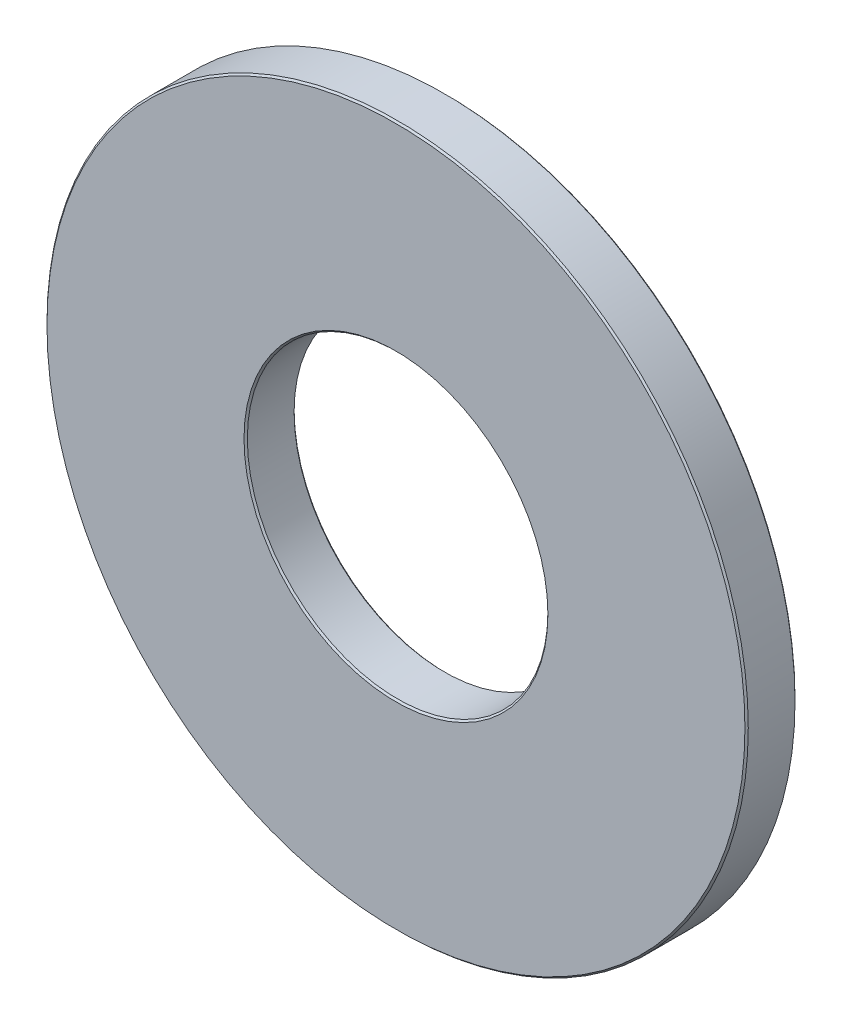
ISO-10303-21;
HEADER;
FILE_DESCRIPTION(('STEP AP214'),'2;1');
FILE_NAME('part.step','',(''),(''),'','','');
FILE_SCHEMA(('AUTOMOTIVE_DESIGN { 1 0 10303 214 1 1 1 1 }'));
ENDSEC;
DATA;
#1=APPLICATION_CONTEXT('core data for automotive mechanical design processes');
#2=APPLICATION_PROTOCOL_DEFINITION('international standard','automotive_design',2000,#1);
#3=PRODUCT_CONTEXT('',#1,'mechanical');
#4=PRODUCT('Part','Part','',(#3));
#5=PRODUCT_RELATED_PRODUCT_CATEGORY('part','',(#4));
#6=PRODUCT_DEFINITION_FORMATION('','',#4);
#7=PRODUCT_DEFINITION_CONTEXT('part definition',#1,'design');
#8=PRODUCT_DEFINITION('design','',#6,#7);
#9=PRODUCT_DEFINITION_SHAPE('','',#8);
#10=(LENGTH_UNIT() NAMED_UNIT(*) SI_UNIT(.MILLI.,.METRE.));
#11=(NAMED_UNIT(*) PLANE_ANGLE_UNIT() SI_UNIT($,.RADIAN.));
#12=(NAMED_UNIT(*) SI_UNIT($,.STERADIAN.) SOLID_ANGLE_UNIT());
#13=UNCERTAINTY_MEASURE_WITH_UNIT(LENGTH_MEASURE(1.E-05),#10,'distance_accuracy_value','');
#14=(GEOMETRIC_REPRESENTATION_CONTEXT(3) GLOBAL_UNCERTAINTY_ASSIGNED_CONTEXT((#13)) GLOBAL_UNIT_ASSIGNED_CONTEXT((#10,
#11,#12)) REPRESENTATION_CONTEXT('',''));
#15=CARTESIAN_POINT('',(0.,0.,0.));
#16=DIRECTION('',(0.,0.,1.));
#17=DIRECTION('',(1.,0.,0.));
#18=AXIS2_PLACEMENT_3D('',#15,#16,#17);
#19=CARTESIAN_POINT('',(0.,0.,-0.75));
#20=DIRECTION('',(0.,0.,1.));
#21=DIRECTION('',(1.,0.,0.));
#22=AXIS2_PLACEMENT_3D('',#19,#20,#21);
#23=CYLINDRICAL_SURFACE('',#22,5.25);
#24=CARTESIAN_POINT('',(0.,0.,-0.0250000000000007));
#25=DIRECTION('',(0.,0.,1.));
#26=DIRECTION('',(1.,0.,0.));
#27=AXIS2_PLACEMENT_3D('',#24,#25,#26);
#28=CIRCLE('',#27,5.25);
#29=CARTESIAN_POINT('',(5.25,0.,-0.0250000000000007));
#30=VERTEX_POINT('',#29);
#31=EDGE_CURVE('E10',#30,#30,#28,.F.);
#32=ORIENTED_EDGE('',*,*,#31,.T.);
#33=EDGE_LOOP('',(#32));
#34=FACE_BOUND('',#33,.T.);
#35=CARTESIAN_POINT('',(0.,0.,-0.725));
#36=DIRECTION('',(0.,0.,1.));
#37=DIRECTION('',(1.,0.,0.));
#38=AXIS2_PLACEMENT_3D('',#35,#36,#37);
#39=CIRCLE('',#38,5.25);
#40=CARTESIAN_POINT('',(5.25,0.,-0.725));
#41=VERTEX_POINT('',#40);
#42=EDGE_CURVE('E51',#41,#41,#39,.T.);
#43=ORIENTED_EDGE('',*,*,#42,.T.);
#44=EDGE_LOOP('',(#43));
#45=FACE_BOUND('',#44,.T.);
#46=ADVANCED_FACE('F43',(#34,#45),#23,.T.);
#47=CARTESIAN_POINT('',(0.,0.,-0.75));
#48=DIRECTION('',(0.,0.,1.));
#49=DIRECTION('',(1.,0.,0.));
#50=AXIS2_PLACEMENT_3D('',#47,#48,#49);
#51=PLANE('',#50);
#52=CARTESIAN_POINT('',(0.,0.,-0.75));
#53=DIRECTION('',(0.,0.,1.));
#54=DIRECTION('',(1.,0.,0.));
#55=AXIS2_PLACEMENT_3D('',#52,#53,#54);
#56=CIRCLE('',#55,2.275);
#57=CARTESIAN_POINT('',(2.275,0.,-0.75));
#58=VERTEX_POINT('',#57);
#59=EDGE_CURVE('E55',#58,#58,#56,.T.);
#60=ORIENTED_EDGE('',*,*,#59,.T.);
#61=EDGE_LOOP('',(#60));
#62=FACE_BOUND('',#61,.T.);
#63=CARTESIAN_POINT('',(0.,0.,-0.75));
#64=DIRECTION('',(0.,0.,1.));
#65=DIRECTION('',(1.,0.,0.));
#66=AXIS2_PLACEMENT_3D('',#63,#64,#65);
#67=CIRCLE('',#66,5.225);
#68=CARTESIAN_POINT('',(5.225,0.,-0.75));
#69=VERTEX_POINT('',#68);
#70=EDGE_CURVE('E59',#69,#69,#67,.F.);
#71=ORIENTED_EDGE('',*,*,#70,.T.);
#72=EDGE_LOOP('',(#71));
#73=FACE_BOUND('',#72,.T.);
#74=ADVANCED_FACE('F87',(#62,#73),#51,.F.);
#75=CARTESIAN_POINT('',(0.,0.,0.));
#76=DIRECTION('',(0.,0.,1.));
#77=DIRECTION('',(1.,0.,0.));
#78=AXIS2_PLACEMENT_3D('',#75,#76,#77);
#79=PLANE('',#78);
#80=CARTESIAN_POINT('',(0.,0.,0.));
#81=DIRECTION('',(0.,0.,1.));
#82=DIRECTION('',(1.,0.,0.));
#83=AXIS2_PLACEMENT_3D('',#80,#81,#82);
#84=CIRCLE('',#83,2.275);
#85=CARTESIAN_POINT('',(2.275,0.,0.));
#86=VERTEX_POINT('',#85);
#87=EDGE_CURVE('E64',#86,#86,#84,.F.);
#88=ORIENTED_EDGE('',*,*,#87,.T.);
#89=EDGE_LOOP('',(#88));
#90=FACE_BOUND('',#89,.T.);
#91=CARTESIAN_POINT('',(0.,0.,0.));
#92=DIRECTION('',(0.,0.,1.));
#93=DIRECTION('',(1.,0.,0.));
#94=AXIS2_PLACEMENT_3D('',#91,#92,#93);
#95=CIRCLE('',#94,5.225);
#96=CARTESIAN_POINT('',(5.225,0.,0.));
#97=VERTEX_POINT('',#96);
#98=EDGE_CURVE('E67',#97,#97,#95,.T.);
#99=ORIENTED_EDGE('',*,*,#98,.T.);
#100=EDGE_LOOP('',(#99));
#101=FACE_BOUND('',#100,.T.);
#102=ADVANCED_FACE('F90',(#90,#101),#79,.T.);
#103=CARTESIAN_POINT('',(0.,0.,-0.75));
#104=DIRECTION('',(0.,0.,1.));
#105=DIRECTION('',(1.,0.,0.));
#106=AXIS2_PLACEMENT_3D('',#103,#104,#105);
#107=CYLINDRICAL_SURFACE('',#106,2.25);
#108=CARTESIAN_POINT('',(0.,0.,-0.0249999999999985));
#109=DIRECTION('',(0.,0.,1.));
#110=DIRECTION('',(1.,0.,0.));
#111=AXIS2_PLACEMENT_3D('',#108,#109,#110);
#112=CIRCLE('',#111,2.25);
#113=CARTESIAN_POINT('',(2.25,0.,-0.0249999999999985));
#114=VERTEX_POINT('',#113);
#115=EDGE_CURVE('E70',#114,#114,#112,.T.);
#116=ORIENTED_EDGE('',*,*,#115,.T.);
#117=EDGE_LOOP('',(#116));
#118=FACE_BOUND('',#117,.T.);
#119=CARTESIAN_POINT('',(0.,0.,-0.725000000000001));
#120=DIRECTION('',(0.,0.,1.));
#121=DIRECTION('',(1.,0.,0.));
#122=AXIS2_PLACEMENT_3D('',#119,#120,#121);
#123=CIRCLE('',#122,2.25);
#124=CARTESIAN_POINT('',(2.25,0.,-0.725000000000001));
#125=VERTEX_POINT('',#124);
#126=EDGE_CURVE('E73',#125,#125,#123,.F.);
#127=ORIENTED_EDGE('',*,*,#126,.T.);
#128=EDGE_LOOP('',(#127));
#129=FACE_BOUND('',#128,.T.);
#130=ADVANCED_FACE('F77',(#118,#129),#107,.F.);
#131=CARTESIAN_POINT('',(0.,0.,-0.0249999999999985));
#132=DIRECTION('',(0.,0.,1.));
#133=DIRECTION('',(1.,0.,0.));
#134=AXIS2_PLACEMENT_3D('',#131,#132,#133);
#135=CONICAL_SURFACE('',#134,2.25,0.785398163397466);
#136=CARTESIAN_POINT('',(2.275,0.,0.));
#137=CARTESIAN_POINT('',(2.27473958333333,0.,-0.000260416666666668));
#138=CARTESIAN_POINT('',(2.27447916666667,0.,-0.000520833333333313));
#139=CARTESIAN_POINT('',(2.27395833333333,0.,-0.0010416666666666));
#140=CARTESIAN_POINT('',(2.27369791666667,0.,-0.00130208333333325));
#141=CARTESIAN_POINT('',(2.27317708333333,0.,-0.00182291666666658));
#142=CARTESIAN_POINT('',(2.27291666666667,0.,-0.00208333333333326));
#143=CARTESIAN_POINT('',(2.27239583333333,0.,-0.00260416666666655));
#144=CARTESIAN_POINT('',(2.27213541666667,0.,-0.00286458333333314));
#145=CARTESIAN_POINT('',(2.27161458333333,0.,-0.00338541666666643));
#146=CARTESIAN_POINT('',(2.27135416666667,0.,-0.00364583333333311));
#147=CARTESIAN_POINT('',(2.27083333333333,0.,-0.00416666666666644));
#148=CARTESIAN_POINT('',(2.27057291666667,0.,-0.00442708333333308));
#149=CARTESIAN_POINT('',(2.27005208333333,0.,-0.00494791666666638));
#150=CARTESIAN_POINT('',(2.26979166666667,0.,-0.00520833333333304));
#151=CARTESIAN_POINT('',(2.26927083333333,0.,-0.00572916666666633));
#152=CARTESIAN_POINT('',(2.26901041666667,0.,-0.00598958333333298));
#153=CARTESIAN_POINT('',(2.26848958333333,0.,-0.0065104166666663));
#154=CARTESIAN_POINT('',(2.26822916666667,0.,-0.00677083333333299));
#155=CARTESIAN_POINT('',(2.26770833333333,0.,-0.00729166666666627));
#156=CARTESIAN_POINT('',(2.26744791666667,0.,-0.00755208333333287));
#157=CARTESIAN_POINT('',(2.26692708333333,0.,-0.00807291666666616));
#158=CARTESIAN_POINT('',(2.26666666666667,0.,-0.00833333333333284));
#159=CARTESIAN_POINT('',(2.26614583333333,0.,-0.00885416666666617));
#160=CARTESIAN_POINT('',(2.26588541666667,0.,-0.00911458333333281));
#161=CARTESIAN_POINT('',(2.26536458333333,0.,-0.00963541666666611));
#162=CARTESIAN_POINT('',(2.26510416666667,0.,-0.00989583333333276));
#163=CARTESIAN_POINT('',(2.26458333333333,0.,-0.0104166666666661));
#164=CARTESIAN_POINT('',(2.26432291666667,0.,-0.0106770833333327));
#165=CARTESIAN_POINT('',(2.26380208333333,0.,-0.011197916666666));
#166=CARTESIAN_POINT('',(2.26354166666667,0.,-0.0114583333333327));
#167=CARTESIAN_POINT('',(2.26302083333333,0.,-0.011979166666666));
#168=CARTESIAN_POINT('',(2.26276041666667,0.,-0.0122395833333327));
#169=CARTESIAN_POINT('',(2.26223958333333,0.,-0.012760416666666));
#170=CARTESIAN_POINT('',(2.26197916666667,0.,-0.0130208333333326));
#171=CARTESIAN_POINT('',(2.26145833333333,0.,-0.0135416666666658));
#172=CARTESIAN_POINT('',(2.26119791666667,0.,-0.0138020833333325));
#173=CARTESIAN_POINT('',(2.26067708333333,0.,-0.0143229166666658));
#174=CARTESIAN_POINT('',(2.26041666666667,0.,-0.0145833333333325));
#175=CARTESIAN_POINT('',(2.25989583333333,0.,-0.0151041666666658));
#176=CARTESIAN_POINT('',(2.25963541666667,0.,-0.0153645833333324));
#177=CARTESIAN_POINT('',(2.25911458333333,0.,-0.0158854166666657));
#178=CARTESIAN_POINT('',(2.25885416666667,0.,-0.0161458333333324));
#179=CARTESIAN_POINT('',(2.25833333333333,0.,-0.0166666666666657));
#180=CARTESIAN_POINT('',(2.25807291666667,0.,-0.0169270833333324));
#181=CARTESIAN_POINT('',(2.25755208333333,0.,-0.0174479166666657));
#182=CARTESIAN_POINT('',(2.25729166666667,0.,-0.0177083333333323));
#183=CARTESIAN_POINT('',(2.25677083333333,0.,-0.0182291666666656));
#184=CARTESIAN_POINT('',(2.25651041666667,0.,-0.0184895833333322));
#185=CARTESIAN_POINT('',(2.25598958333333,0.,-0.0190104166666656));
#186=CARTESIAN_POINT('',(2.25572916666667,0.,-0.0192708333333322));
#187=CARTESIAN_POINT('',(2.25520833333333,0.,-0.0197916666666655));
#188=CARTESIAN_POINT('',(2.25494791666667,0.,-0.0200520833333322));
#189=CARTESIAN_POINT('',(2.25442708333333,0.,-0.0205729166666655));
#190=CARTESIAN_POINT('',(2.25416666666667,0.,-0.0208333333333321));
#191=CARTESIAN_POINT('',(2.25364583333333,0.,-0.0213541666666654));
#192=CARTESIAN_POINT('',(2.25338541666667,0.,-0.0216145833333321));
#193=CARTESIAN_POINT('',(2.25286458333333,0.,-0.0221354166666654));
#194=CARTESIAN_POINT('',(2.25260416666667,0.,-0.022395833333332));
#195=CARTESIAN_POINT('',(2.25208333333333,0.,-0.0229166666666653));
#196=CARTESIAN_POINT('',(2.25182291666667,0.,-0.023177083333332));
#197=CARTESIAN_POINT('',(2.25130208333333,0.,-0.0236979166666653));
#198=CARTESIAN_POINT('',(2.25104166666667,0.,-0.0239583333333319));
#199=CARTESIAN_POINT('',(2.25052083333333,0.,-0.0244791666666652));
#200=CARTESIAN_POINT('',(2.25026041666667,0.,-0.0247395833333319));
#201=CARTESIAN_POINT('',(2.25,0.,-0.0249999999999985));
#202=B_SPLINE_CURVE_WITH_KNOTS('',3,(#136,#137,#138,#139,#140,#141,#142,#143,#144,#145,#146,
#147,#148,#149,#150,#151,#152,#153,#154,#155,#156,#157,#158,#159,#160,#161,#162,#163,#164,#165,
#166,#167,#168,#169,#170,#171,#172,#173,#174,#175,#176,#177,#178,#179,#180,#181,#182,#183,#184,
#185,#186,#187,#188,#189,#190,#191,#192,#193,#194,#195,#196,#197,#198,#199,#200,#201),
.UNSPECIFIED.,.F.,.F.,(4,2,2,2,2,2,2,2,2,2,2,2,2,2,2,2,2,2,2,2,2,2,2,2,2,2,2,2,2,2,2,2,4),(0.,
0.00110485434560389,0.00220970869120777,0.00331456303681166,0.00441941738241586,
0.00552427172801974,0.00662912607362363,0.00773398041922752,0.00883883476483141,
0.00994368911043529,0.0110485434560395,0.0121533978016434,0.0132582521472473,0.0143631064928511,
0.015467960838455,0.0165728151840589,0.0176776695296628,0.018782523875267,0.0198873782208709,
0.0209922325664748,0.0220970869120787,0.0232019412576826,0.0243067956032864,0.0254116499488906,
0.0265165042944945,0.0276213586400984,0.0287262129857023,0.0298310673313062,0.0309359216769101,
0.0320407760225143,0.0331456303681181,0.034250484713722,0.0353553390593259),.UNSPECIFIED.);
#203=EDGE_CURVE('BSEAM83',#86,#114,#202,.T.);
#204=ORIENTED_EDGE('',*,*,#87,.F.);
#205=ORIENTED_EDGE('',*,*,#115,.F.);
#206=ORIENTED_EDGE('',*,*,#203,.T.);
#207=ORIENTED_EDGE('',*,*,#203,.F.);
#208=EDGE_LOOP('',(#204,#206,#205,#207));
#209=FACE_BOUND('',#208,.T.);
#210=ADVANCED_FACE('F83',(#209),#135,.F.);
#211=CARTESIAN_POINT('',(0.,0.,-0.75));
#212=DIRECTION('',(0.,0.,-1.));
#213=DIRECTION('',(-1.,0.,0.));
#214=AXIS2_PLACEMENT_3D('',#211,#212,#213);
#215=CONICAL_SURFACE('',#214,2.275,0.785398163397448);
#216=ORIENTED_EDGE('',*,*,#126,.F.);
#217=EDGE_LOOP('',(#216));
#218=FACE_BOUND('',#217,.T.);
#219=ORIENTED_EDGE('',*,*,#59,.F.);
#220=EDGE_LOOP('',(#219));
#221=FACE_BOUND('',#220,.T.);
#222=ADVANCED_FACE('F79',(#218,#221),#215,.F.);
#223=CARTESIAN_POINT('',(0.,0.,0.));
#224=DIRECTION('',(0.,0.,-1.));
#225=DIRECTION('',(-1.,0.,0.));
#226=AXIS2_PLACEMENT_3D('',#223,#224,#225);
#227=CONICAL_SURFACE('',#226,5.225,0.785398163397414);
#228=ORIENTED_EDGE('',*,*,#31,.F.);
#229=EDGE_LOOP('',(#228));
#230=FACE_BOUND('',#229,.T.);
#231=ORIENTED_EDGE('',*,*,#98,.F.);
#232=EDGE_LOOP('',(#231));
#233=FACE_BOUND('',#232,.T.);
#234=ADVANCED_FACE('F82',(#230,#233),#227,.T.);
#235=CARTESIAN_POINT('',(0.,0.,-0.725));
#236=DIRECTION('',(0.,0.,1.));
#237=DIRECTION('',(1.,0.,0.));
#238=AXIS2_PLACEMENT_3D('',#235,#236,#237);
#239=CONICAL_SURFACE('',#238,5.25,0.785398163397448);
#240=ORIENTED_EDGE('',*,*,#70,.F.);
#241=EDGE_LOOP('',(#240));
#242=FACE_BOUND('',#241,.T.);
#243=ORIENTED_EDGE('',*,*,#42,.F.);
#244=EDGE_LOOP('',(#243));
#245=FACE_BOUND('',#244,.T.);
#246=ADVANCED_FACE('F46',(#242,#245),#239,.T.);
#247=CLOSED_SHELL('',(#46,#74,#102,#130,#210,#222,#234,#246));
#248=MANIFOLD_SOLID_BREP('B2',#247);
#249=ADVANCED_BREP_SHAPE_REPRESENTATION('',(#18,#248),#14);
#250=SHAPE_DEFINITION_REPRESENTATION(#9,#249);
ENDSEC;
END-ISO-10303-21;
